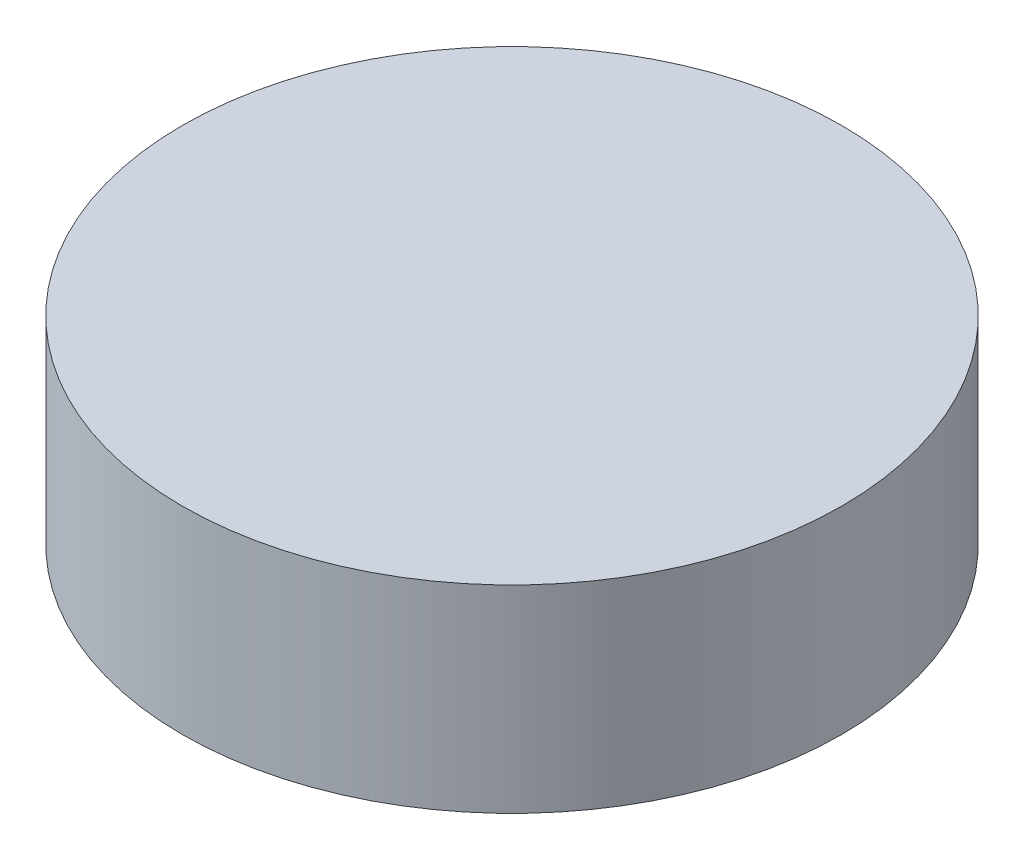
ISO-10303-21;
HEADER;
FILE_DESCRIPTION(('STEP AP214'),'2;1');
FILE_NAME('part.step','',(''),(''),'','','');
FILE_SCHEMA(('AUTOMOTIVE_DESIGN { 1 0 10303 214 1 1 1 1 }'));
ENDSEC;
DATA;
#1=APPLICATION_CONTEXT('core data for automotive mechanical design processes');
#2=APPLICATION_PROTOCOL_DEFINITION('international standard','automotive_design',2000,#1);
#3=PRODUCT_CONTEXT('',#1,'mechanical');
#4=PRODUCT('Part','Part','',(#3));
#5=PRODUCT_RELATED_PRODUCT_CATEGORY('part','',(#4));
#6=PRODUCT_DEFINITION_FORMATION('','',#4);
#7=PRODUCT_DEFINITION_CONTEXT('part definition',#1,'design');
#8=PRODUCT_DEFINITION('design','',#6,#7);
#9=PRODUCT_DEFINITION_SHAPE('','',#8);
#10=(LENGTH_UNIT() NAMED_UNIT(*) SI_UNIT(.MILLI.,.METRE.));
#11=(NAMED_UNIT(*) PLANE_ANGLE_UNIT() SI_UNIT($,.RADIAN.));
#12=(NAMED_UNIT(*) SI_UNIT($,.STERADIAN.) SOLID_ANGLE_UNIT());
#13=UNCERTAINTY_MEASURE_WITH_UNIT(LENGTH_MEASURE(1.E-05),#10,'distance_accuracy_value','');
#14=(GEOMETRIC_REPRESENTATION_CONTEXT(3) GLOBAL_UNCERTAINTY_ASSIGNED_CONTEXT((#13)) GLOBAL_UNIT_ASSIGNED_CONTEXT((#10,
#11,#12)) REPRESENTATION_CONTEXT('',''));
#15=CARTESIAN_POINT('',(0.,0.,0.));
#16=DIRECTION('',(0.,0.,1.));
#17=DIRECTION('',(1.,0.,0.));
#18=AXIS2_PLACEMENT_3D('',#15,#16,#17);
#19=CARTESIAN_POINT('',(0.,6.,0.));
#20=DIRECTION('',(0.,-1.,0.));
#21=DIRECTION('',(0.,0.,-1.));
#22=AXIS2_PLACEMENT_3D('',#19,#20,#21);
#23=CYLINDRICAL_SURFACE('',#22,10.);
#24=CARTESIAN_POINT('',(0.,6.,0.));
#25=DIRECTION('',(0.,1.,0.));
#26=DIRECTION('',(0.,0.,1.));
#27=AXIS2_PLACEMENT_3D('',#24,#25,#26);
#28=CIRCLE('',#27,10.);
#29=CARTESIAN_POINT('',(0.,6.,10.));
#30=VERTEX_POINT('',#29);
#31=EDGE_CURVE('E312',#30,#30,#28,.T.);
#32=ORIENTED_EDGE('',*,*,#31,.F.);
#33=EDGE_LOOP('',(#32));
#34=FACE_BOUND('',#33,.T.);
#35=CARTESIAN_POINT('',(0.,0.,0.));
#36=DIRECTION('',(0.,1.,0.));
#37=DIRECTION('',(0.,0.,1.));
#38=AXIS2_PLACEMENT_3D('',#35,#36,#37);
#39=CIRCLE('',#38,10.);
#40=CARTESIAN_POINT('',(0.,0.,10.));
#41=VERTEX_POINT('',#40);
#42=EDGE_CURVE('E308',#41,#41,#39,.T.);
#43=ORIENTED_EDGE('',*,*,#42,.T.);
#44=EDGE_LOOP('',(#43));
#45=FACE_BOUND('',#44,.T.);
#46=ADVANCED_FACE('F39',(#34,#45),#23,.T.);
#47=CARTESIAN_POINT('',(0.,6.,0.));
#48=DIRECTION('',(0.,1.,0.));
#49=DIRECTION('',(0.,0.,1.));
#50=AXIS2_PLACEMENT_3D('',#47,#48,#49);
#51=PLANE('',#50);
#52=ORIENTED_EDGE('',*,*,#31,.T.);
#53=EDGE_LOOP('',(#52));
#54=FACE_BOUND('',#53,.T.);
#55=ADVANCED_FACE('F393',(#54),#51,.T.);
#56=CARTESIAN_POINT('',(0.,0.,0.));
#57=DIRECTION('',(0.,1.,0.));
#58=DIRECTION('',(0.,0.,1.));
#59=AXIS2_PLACEMENT_3D('',#56,#57,#58);
#60=PLANE('',#59);
#61=CARTESIAN_POINT('',(0.,0.,0.));
#62=DIRECTION('',(0.,-1.,0.));
#63=DIRECTION('',(0.,0.,-1.));
#64=AXIS2_PLACEMENT_3D('',#61,#62,#63);
#65=CIRCLE('',#64,9.);
#66=CARTESIAN_POINT('',(0.,0.,-9.));
#67=VERTEX_POINT('',#66);
#68=EDGE_CURVE('E300',#67,#67,#65,.T.);
#69=ORIENTED_EDGE('',*,*,#68,.F.);
#70=EDGE_LOOP('',(#69));
#71=FACE_BOUND('',#70,.T.);
#72=ORIENTED_EDGE('',*,*,#42,.F.);
#73=EDGE_LOOP('',(#72));
#74=FACE_BOUND('',#73,.T.);
#75=ADVANCED_FACE('F399',(#71,#74),#60,.F.);
#76=CARTESIAN_POINT('',(0.,4.,0.));
#77=DIRECTION('',(0.,-1.,0.));
#78=DIRECTION('',(0.,0.,-1.));
#79=AXIS2_PLACEMENT_3D('',#76,#77,#78);
#80=CYLINDRICAL_SURFACE('',#79,9.);
#81=CARTESIAN_POINT('',(0.,4.,0.));
#82=DIRECTION('',(0.,-1.,0.));
#83=DIRECTION('',(0.,0.,-1.));
#84=AXIS2_PLACEMENT_3D('',#81,#82,#83);
#85=CIRCLE('',#84,9.);
#86=CARTESIAN_POINT('',(0.,4.,-9.));
#87=VERTEX_POINT('',#86);
#88=EDGE_CURVE('E304',#87,#87,#85,.T.);
#89=ORIENTED_EDGE('',*,*,#88,.F.);
#90=EDGE_LOOP('',(#89));
#91=FACE_BOUND('',#90,.T.);
#92=ORIENTED_EDGE('',*,*,#68,.T.);
#93=EDGE_LOOP('',(#92));
#94=FACE_BOUND('',#93,.T.);
#95=ADVANCED_FACE('F458',(#91,#94),#80,.F.);
#96=CARTESIAN_POINT('',(0.,4.,0.));
#97=DIRECTION('',(0.,-1.,0.));
#98=DIRECTION('',(0.,0.,-1.));
#99=AXIS2_PLACEMENT_3D('',#96,#97,#98);
#100=PLANE('',#99);
#101=CARTESIAN_POINT('',(0.,4.,0.));
#102=DIRECTION('',(0.,-1.,0.));
#103=DIRECTION('',(0.,0.,-1.));
#104=AXIS2_PLACEMENT_3D('',#101,#102,#103);
#105=CIRCLE('',#104,2.85);
#106=CARTESIAN_POINT('',(0.,4.,2.85));
#107=VERTEX_POINT('',#106);
#108=EDGE_CURVE('E276',#107,#107,#105,.T.);
#109=ORIENTED_EDGE('',*,*,#108,.F.);
#110=EDGE_LOOP('',(#109));
#111=FACE_BOUND('',#110,.T.);
#112=ORIENTED_EDGE('',*,*,#88,.T.);
#113=EDGE_LOOP('',(#112));
#114=FACE_BOUND('',#113,.T.);
#115=ADVANCED_FACE('F454',(#111,#114),#100,.T.);
#116=CARTESIAN_POINT('',(0.,-2.5,0.));
#117=DIRECTION('',(0.,1.,0.));
#118=DIRECTION('',(0.,0.,1.));
#119=AXIS2_PLACEMENT_3D('',#116,#117,#118);
#120=CYLINDRICAL_SURFACE('',#119,2.85);
#121=CARTESIAN_POINT('',(0.,-2.5,0.));
#122=DIRECTION('',(0.,-1.,0.));
#123=DIRECTION('',(0.,0.,-1.));
#124=AXIS2_PLACEMENT_3D('',#121,#122,#123);
#125=CIRCLE('',#124,2.85);
#126=CARTESIAN_POINT('',(0.,-2.5,2.85));
#127=VERTEX_POINT('',#126);
#128=EDGE_CURVE('E296',#127,#127,#125,.T.);
#129=CARTESIAN_POINT('',(0.,-2.5,2.85));
#130=CARTESIAN_POINT('',(0.,-2.43229166666667,2.85));
#131=CARTESIAN_POINT('',(0.,-2.36458333333333,2.85));
#132=CARTESIAN_POINT('',(0.,-2.22916666666667,2.85));
#133=CARTESIAN_POINT('',(0.,-2.16145833333333,2.85));
#134=CARTESIAN_POINT('',(0.,-2.02604166666667,2.85));
#135=CARTESIAN_POINT('',(0.,-1.95833333333333,2.85));
#136=CARTESIAN_POINT('',(0.,-1.82291666666667,2.85));
#137=CARTESIAN_POINT('',(0.,-1.75520833333333,2.85));
#138=CARTESIAN_POINT('',(0.,-1.61979166666667,2.85));
#139=CARTESIAN_POINT('',(0.,-1.55208333333333,2.85));
#140=CARTESIAN_POINT('',(0.,-1.41666666666667,2.85));
#141=CARTESIAN_POINT('',(0.,-1.34895833333333,2.85));
#142=CARTESIAN_POINT('',(0.,-1.21354166666667,2.85));
#143=CARTESIAN_POINT('',(0.,-1.14583333333333,2.85));
#144=CARTESIAN_POINT('',(0.,-1.01041666666667,2.85));
#145=CARTESIAN_POINT('',(0.,-0.942708333333333,2.85));
#146=CARTESIAN_POINT('',(0.,-0.807291666666666,2.85));
#147=CARTESIAN_POINT('',(0.,-0.739583333333333,2.85));
#148=CARTESIAN_POINT('',(0.,-0.604166666666666,2.85));
#149=CARTESIAN_POINT('',(0.,-0.536458333333333,2.85));
#150=CARTESIAN_POINT('',(0.,-0.401041666666667,2.85));
#151=CARTESIAN_POINT('',(0.,-0.333333333333333,2.85));
#152=CARTESIAN_POINT('',(0.,-0.197916666666666,2.85));
#153=CARTESIAN_POINT('',(0.,-0.130208333333333,2.85));
#154=CARTESIAN_POINT('',(0.,0.00520833333333364,2.85));
#155=CARTESIAN_POINT('',(0.,0.0729166666666669,2.85));
#156=CARTESIAN_POINT('',(0.,0.208333333333334,2.85));
#157=CARTESIAN_POINT('',(0.,0.276041666666667,2.85));
#158=CARTESIAN_POINT('',(0.,0.411458333333334,2.85));
#159=CARTESIAN_POINT('',(0.,0.479166666666667,2.85));
#160=CARTESIAN_POINT('',(0.,0.614583333333333,2.85));
#161=CARTESIAN_POINT('',(0.,0.682291666666667,2.85));
#162=CARTESIAN_POINT('',(0.,0.817708333333334,2.85));
#163=CARTESIAN_POINT('',(0.,0.885416666666667,2.85));
#164=CARTESIAN_POINT('',(0.,1.02083333333333,2.85));
#165=CARTESIAN_POINT('',(0.,1.08854166666667,2.85));
#166=CARTESIAN_POINT('',(0.,1.22395833333333,2.85));
#167=CARTESIAN_POINT('',(0.,1.29166666666667,2.85));
#168=CARTESIAN_POINT('',(0.,1.42708333333333,2.85));
#169=CARTESIAN_POINT('',(0.,1.49479166666667,2.85));
#170=CARTESIAN_POINT('',(0.,1.63020833333333,2.85));
#171=CARTESIAN_POINT('',(0.,1.69791666666667,2.85));
#172=CARTESIAN_POINT('',(0.,1.83333333333333,2.85));
#173=CARTESIAN_POINT('',(0.,1.90104166666667,2.85));
#174=CARTESIAN_POINT('',(0.,2.03645833333333,2.85));
#175=CARTESIAN_POINT('',(0.,2.10416666666667,2.85));
#176=CARTESIAN_POINT('',(0.,2.23958333333333,2.85));
#177=CARTESIAN_POINT('',(0.,2.30729166666667,2.85));
#178=CARTESIAN_POINT('',(0.,2.44270833333333,2.85));
#179=CARTESIAN_POINT('',(0.,2.51041666666667,2.85));
#180=CARTESIAN_POINT('',(0.,2.64583333333333,2.85));
#181=CARTESIAN_POINT('',(0.,2.71354166666667,2.85));
#182=CARTESIAN_POINT('',(0.,2.84895833333333,2.85));
#183=CARTESIAN_POINT('',(0.,2.91666666666667,2.85));
#184=CARTESIAN_POINT('',(0.,3.05208333333333,2.85));
#185=CARTESIAN_POINT('',(0.,3.11979166666667,2.85));
#186=CARTESIAN_POINT('',(0.,3.25520833333333,2.85));
#187=CARTESIAN_POINT('',(0.,3.32291666666667,2.85));
#188=CARTESIAN_POINT('',(0.,3.45833333333333,2.85));
#189=CARTESIAN_POINT('',(0.,3.52604166666667,2.85));
#190=CARTESIAN_POINT('',(0.,3.66145833333333,2.85));
#191=CARTESIAN_POINT('',(0.,3.72916666666667,2.85));
#192=CARTESIAN_POINT('',(0.,3.86458333333333,2.85));
#193=CARTESIAN_POINT('',(0.,3.93229166666667,2.85));
#194=CARTESIAN_POINT('',(0.,4.,2.85));
#195=B_SPLINE_CURVE_WITH_KNOTS('',3,(#129,#130,#131,#132,#133,#134,#135,#136,#137,#138,#139,
#140,#141,#142,#143,#144,#145,#146,#147,#148,#149,#150,#151,#152,#153,#154,#155,#156,#157,#158,
#159,#160,#161,#162,#163,#164,#165,#166,#167,#168,#169,#170,#171,#172,#173,#174,#175,#176,#177,
#178,#179,#180,#181,#182,#183,#184,#185,#186,#187,#188,#189,#190,#191,#192,#193,#194),
.UNSPECIFIED.,.F.,.F.,(4,2,2,2,2,2,2,2,2,2,2,2,2,2,2,2,2,2,2,2,2,2,2,2,2,2,2,2,2,2,2,2,4),(0.,
0.203125,0.40625,0.609375,0.8125,1.015625,1.21875,1.421875,1.625,1.828125,2.03125,2.234375,
2.4375,2.640625,2.84375,3.046875,3.25,3.453125,3.65625,3.859375,4.0625,4.265625,4.46875,
4.671875,4.875,5.078125,5.28125,5.484375,5.6875,5.890625,6.09375,6.296875,6.5),.UNSPECIFIED.);
#196=EDGE_CURVE('BSEAM451',#127,#107,#195,.T.);
#197=ORIENTED_EDGE('',*,*,#128,.F.);
#198=ORIENTED_EDGE('',*,*,#108,.T.);
#199=ORIENTED_EDGE('',*,*,#196,.T.);
#200=ORIENTED_EDGE('',*,*,#196,.F.);
#201=EDGE_LOOP('',(#197,#199,#198,#200));
#202=FACE_BOUND('',#201,.T.);
#203=ADVANCED_FACE('F451',(#202),#120,.T.);
#204=CARTESIAN_POINT('',(0.,-2.5,0.));
#205=DIRECTION('',(0.,-1.,0.));
#206=DIRECTION('',(0.,0.,-1.));
#207=AXIS2_PLACEMENT_3D('',#204,#205,#206);
#208=PLANE('',#207);
#209=DIRECTION('',(0.,0.,1.));
#210=VECTOR('',#209,1.);
#211=CARTESIAN_POINT('',(0.6,-2.5,0.));
#212=LINE('',#211,#210);
#213=CARTESIAN_POINT('',(0.6,-2.5,1.1));
#214=VERTEX_POINT('',#213);
#215=CARTESIAN_POINT('',(0.6,-2.5,2.05));
#216=VERTEX_POINT('',#215);
#217=EDGE_CURVE('E260',#214,#216,#212,.T.);
#218=ORIENTED_EDGE('',*,*,#217,.F.);
#219=CARTESIAN_POINT('',(1.1,-2.5,1.1));
#220=DIRECTION('',(0.,-1.,0.));
#221=DIRECTION('',(0.,0.,-1.));
#222=AXIS2_PLACEMENT_3D('',#219,#220,#221);
#223=CIRCLE('',#222,0.5);
#224=CARTESIAN_POINT('',(1.1,-2.5,0.6));
#225=VERTEX_POINT('',#224);
#226=EDGE_CURVE('E330',#214,#225,#223,.T.);
#227=ORIENTED_EDGE('',*,*,#226,.T.);
#228=DIRECTION('',(-1.,0.,0.));
#229=VECTOR('',#228,1.);
#230=CARTESIAN_POINT('',(0.,-2.5,0.6));
#231=LINE('',#230,#229);
#232=CARTESIAN_POINT('',(2.05,-2.5,0.6));
#233=VERTEX_POINT('',#232);
#234=EDGE_CURVE('E256',#233,#225,#231,.T.);
#235=ORIENTED_EDGE('',*,*,#234,.F.);
#236=DIRECTION('',(0.,0.,-1.));
#237=VECTOR('',#236,1.);
#238=CARTESIAN_POINT('',(2.05,-2.5,0.));
#239=LINE('',#238,#237);
#240=CARTESIAN_POINT('',(2.05,-2.5,-0.6));
#241=VERTEX_POINT('',#240);
#242=EDGE_CURVE('E252',#233,#241,#239,.T.);
#243=ORIENTED_EDGE('',*,*,#242,.T.);
#244=DIRECTION('',(-1.,0.,0.));
#245=VECTOR('',#244,1.);
#246=CARTESIAN_POINT('',(0.,-2.5,-0.6));
#247=LINE('',#246,#245);
#248=CARTESIAN_POINT('',(1.1,-2.5,-0.6));
#249=VERTEX_POINT('',#248);
#250=EDGE_CURVE('E249',#241,#249,#247,.T.);
#251=ORIENTED_EDGE('',*,*,#250,.T.);
#252=CARTESIAN_POINT('',(1.1,-2.5,-1.1));
#253=DIRECTION('',(0.,-1.,0.));
#254=DIRECTION('',(0.,0.,-1.));
#255=AXIS2_PLACEMENT_3D('',#252,#253,#254);
#256=CIRCLE('',#255,0.5);
#257=CARTESIAN_POINT('',(0.6,-2.5,-1.1));
#258=VERTEX_POINT('',#257);
#259=EDGE_CURVE('E157',#249,#258,#256,.T.);
#260=ORIENTED_EDGE('',*,*,#259,.T.);
#261=DIRECTION('',(0.,0.,1.));
#262=VECTOR('',#261,1.);
#263=CARTESIAN_POINT('',(0.6,-2.5,0.));
#264=LINE('',#263,#262);
#265=CARTESIAN_POINT('',(0.6,-2.5,-2.05));
#266=VERTEX_POINT('',#265);
#267=EDGE_CURVE('E245',#266,#258,#264,.T.);
#268=ORIENTED_EDGE('',*,*,#267,.F.);
#269=DIRECTION('',(1.,0.,0.));
#270=VECTOR('',#269,1.);
#271=CARTESIAN_POINT('',(0.,-2.5,-2.05));
#272=LINE('',#271,#270);
#273=CARTESIAN_POINT('',(-0.6,-2.5,-2.05));
#274=VERTEX_POINT('',#273);
#275=EDGE_CURVE('E241',#274,#266,#272,.T.);
#276=ORIENTED_EDGE('',*,*,#275,.F.);
#277=DIRECTION('',(0.,0.,1.));
#278=VECTOR('',#277,1.);
#279=CARTESIAN_POINT('',(-0.6,-2.5,0.));
#280=LINE('',#279,#278);
#281=CARTESIAN_POINT('',(-0.6,-2.5,-1.1));
#282=VERTEX_POINT('',#281);
#283=EDGE_CURVE('E237',#274,#282,#280,.T.);
#284=ORIENTED_EDGE('',*,*,#283,.T.);
#285=CARTESIAN_POINT('',(-1.1,-2.5,-1.1));
#286=DIRECTION('',(0.,-1.,0.));
#287=DIRECTION('',(0.,0.,-1.));
#288=AXIS2_PLACEMENT_3D('',#285,#286,#287);
#289=CIRCLE('',#288,0.5);
#290=CARTESIAN_POINT('',(-1.1,-2.5,-0.6));
#291=VERTEX_POINT('',#290);
#292=EDGE_CURVE('E324',#282,#291,#289,.T.);
#293=ORIENTED_EDGE('',*,*,#292,.T.);
#294=DIRECTION('',(-1.,0.,0.));
#295=VECTOR('',#294,1.);
#296=CARTESIAN_POINT('',(0.,-2.5,-0.6));
#297=LINE('',#296,#295);
#298=CARTESIAN_POINT('',(-2.05,-2.5,-0.6));
#299=VERTEX_POINT('',#298);
#300=EDGE_CURVE('E233',#291,#299,#297,.T.);
#301=ORIENTED_EDGE('',*,*,#300,.T.);
#302=DIRECTION('',(0.,0.,-1.));
#303=VECTOR('',#302,1.);
#304=CARTESIAN_POINT('',(-2.05,-2.5,0.));
#305=LINE('',#304,#303);
#306=CARTESIAN_POINT('',(-2.05,-2.5,0.6));
#307=VERTEX_POINT('',#306);
#308=EDGE_CURVE('E229',#307,#299,#305,.T.);
#309=ORIENTED_EDGE('',*,*,#308,.F.);
#310=DIRECTION('',(-1.,0.,0.));
#311=VECTOR('',#310,1.);
#312=CARTESIAN_POINT('',(0.,-2.5,0.6));
#313=LINE('',#312,#311);
#314=CARTESIAN_POINT('',(-1.1,-2.5,0.6));
#315=VERTEX_POINT('',#314);
#316=EDGE_CURVE('E225',#315,#307,#313,.T.);
#317=ORIENTED_EDGE('',*,*,#316,.F.);
#318=CARTESIAN_POINT('',(-1.1,-2.5,1.1));
#319=DIRECTION('',(0.,-1.,0.));
#320=DIRECTION('',(0.,0.,-1.));
#321=AXIS2_PLACEMENT_3D('',#318,#319,#320);
#322=CIRCLE('',#321,0.5);
#323=CARTESIAN_POINT('',(-0.6,-2.5,1.1));
#324=VERTEX_POINT('',#323);
#325=EDGE_CURVE('E327',#315,#324,#322,.T.);
#326=ORIENTED_EDGE('',*,*,#325,.T.);
#327=DIRECTION('',(0.,0.,1.));
#328=VECTOR('',#327,1.);
#329=CARTESIAN_POINT('',(-0.6,-2.5,0.));
#330=LINE('',#329,#328);
#331=CARTESIAN_POINT('',(-0.6,-2.5,2.05));
#332=VERTEX_POINT('',#331);
#333=EDGE_CURVE('E268',#324,#332,#330,.T.);
#334=ORIENTED_EDGE('',*,*,#333,.T.);
#335=DIRECTION('',(1.,0.,0.));
#336=VECTOR('',#335,1.);
#337=CARTESIAN_POINT('',(0.,-2.5,2.05));
#338=LINE('',#337,#336);
#339=EDGE_CURVE('E264',#332,#216,#338,.T.);
#340=ORIENTED_EDGE('',*,*,#339,.T.);
#341=EDGE_LOOP('',(#218,#227,#235,#243,#251,#260,#268,#276,#284,#293,#301,#309,#317,#326,#334,#340));
#342=FACE_BOUND('',#341,.T.);
#343=ORIENTED_EDGE('',*,*,#128,.T.);
#344=EDGE_LOOP('',(#343));
#345=FACE_BOUND('',#344,.T.);
#346=ADVANCED_FACE('F354',(#342,#345),#208,.T.);
#347=CARTESIAN_POINT('',(0.,4.,0.6));
#348=DIRECTION('',(0.,0.,1.));
#349=DIRECTION('',(1.,0.,0.));
#350=AXIS2_PLACEMENT_3D('',#347,#348,#349);
#351=PLANE('',#350);
#352=DIRECTION('',(0.,-1.,0.));
#353=VECTOR('',#352,1.);
#354=CARTESIAN_POINT('',(-2.05,4.,0.6));
#355=LINE('',#354,#353);
#356=CARTESIAN_POINT('',(-2.05,-0.999999999999998,0.6));
#357=VERTEX_POINT('',#356);
#358=EDGE_CURVE('E272',#357,#307,#355,.T.);
#359=ORIENTED_EDGE('',*,*,#358,.F.);
#360=DIRECTION('',(1.,0.,0.));
#361=VECTOR('',#360,1.);
#362=CARTESIAN_POINT('',(0.,-1.,0.6));
#363=LINE('',#362,#361);
#364=CARTESIAN_POINT('',(-1.1,-1.,0.6));
#365=VERTEX_POINT('',#364);
#366=EDGE_CURVE('E211',#357,#365,#363,.T.);
#367=ORIENTED_EDGE('',*,*,#366,.T.);
#368=DIRECTION('',(0.,-1.,0.));
#369=VECTOR('',#368,1.);
#370=CARTESIAN_POINT('',(-1.1,-2.5,0.6));
#371=LINE('',#370,#369);
#372=EDGE_CURVE('E337',#365,#315,#371,.T.);
#373=ORIENTED_EDGE('',*,*,#372,.T.);
#374=ORIENTED_EDGE('',*,*,#316,.T.);
#375=EDGE_LOOP('',(#359,#367,#373,#374));
#376=FACE_BOUND('',#375,.T.);
#377=ADVANCED_FACE('F390',(#376),#351,.F.);
#378=CARTESIAN_POINT('',(-0.6,4.,0.));
#379=DIRECTION('',(1.,0.,0.));
#380=DIRECTION('',(0.,0.,-1.));
#381=AXIS2_PLACEMENT_3D('',#378,#379,#380);
#382=PLANE('',#381);
#383=DIRECTION('',(0.,0.,-1.));
#384=VECTOR('',#383,1.);
#385=CARTESIAN_POINT('',(-0.6,-1.,0.));
#386=LINE('',#385,#384);
#387=CARTESIAN_POINT('',(-0.6,-0.999999999999998,2.05));
#388=VERTEX_POINT('',#387);
#389=CARTESIAN_POINT('',(-0.6,-1.,1.1));
#390=VERTEX_POINT('',#389);
#391=EDGE_CURVE('E55',#388,#390,#386,.T.);
#392=ORIENTED_EDGE('',*,*,#391,.F.);
#393=DIRECTION('',(0.,-1.,0.));
#394=VECTOR('',#393,1.);
#395=CARTESIAN_POINT('',(-0.6,4.,2.05));
#396=LINE('',#395,#394);
#397=EDGE_CURVE('E273',#388,#332,#396,.T.);
#398=ORIENTED_EDGE('',*,*,#397,.T.);
#399=ORIENTED_EDGE('',*,*,#333,.F.);
#400=DIRECTION('',(0.,-1.,0.));
#401=VECTOR('',#400,1.);
#402=CARTESIAN_POINT('',(-0.6,4.,1.1));
#403=LINE('',#402,#401);
#404=EDGE_CURVE('E340',#324,#390,#403,.F.);
#405=ORIENTED_EDGE('',*,*,#404,.T.);
#406=EDGE_LOOP('',(#392,#398,#399,#405));
#407=FACE_BOUND('',#406,.T.);
#408=ADVANCED_FACE('F379',(#407),#382,.T.);
#409=CARTESIAN_POINT('',(0.,4.,2.05));
#410=DIRECTION('',(0.,0.,-1.));
#411=DIRECTION('',(-1.,0.,0.));
#412=AXIS2_PLACEMENT_3D('',#409,#410,#411);
#413=PLANE('',#412);
#414=DIRECTION('',(-1.,0.,0.));
#415=VECTOR('',#414,1.);
#416=CARTESIAN_POINT('',(0.,-1.,2.05));
#417=LINE('',#416,#415);
#418=CARTESIAN_POINT('',(0.6,-0.999999999999998,2.05));
#419=VERTEX_POINT('',#418);
#420=EDGE_CURVE('E62',#419,#388,#417,.T.);
#421=ORIENTED_EDGE('',*,*,#420,.F.);
#422=DIRECTION('',(0.,-1.,0.));
#423=VECTOR('',#422,1.);
#424=CARTESIAN_POINT('',(0.6,4.,2.05));
#425=LINE('',#424,#423);
#426=EDGE_CURVE('E277',#419,#216,#425,.T.);
#427=ORIENTED_EDGE('',*,*,#426,.T.);
#428=ORIENTED_EDGE('',*,*,#339,.F.);
#429=ORIENTED_EDGE('',*,*,#397,.F.);
#430=EDGE_LOOP('',(#421,#427,#428,#429));
#431=FACE_BOUND('',#430,.T.);
#432=ADVANCED_FACE('F382',(#431),#413,.T.);
#433=CARTESIAN_POINT('',(0.6,4.,0.));
#434=DIRECTION('',(1.,0.,0.));
#435=DIRECTION('',(0.,0.,-1.));
#436=AXIS2_PLACEMENT_3D('',#433,#434,#435);
#437=PLANE('',#436);
#438=ORIENTED_EDGE('',*,*,#426,.F.);
#439=DIRECTION('',(0.,0.,-1.));
#440=VECTOR('',#439,1.);
#441=CARTESIAN_POINT('',(0.6,-1.,0.));
#442=LINE('',#441,#440);
#443=CARTESIAN_POINT('',(0.6,-1.,1.1));
#444=VERTEX_POINT('',#443);
#445=EDGE_CURVE('E197',#419,#444,#442,.T.);
#446=ORIENTED_EDGE('',*,*,#445,.T.);
#447=DIRECTION('',(0.,-1.,0.));
#448=VECTOR('',#447,1.);
#449=CARTESIAN_POINT('',(0.6,4.,1.1));
#450=LINE('',#449,#448);
#451=EDGE_CURVE('E316',#444,#214,#450,.T.);
#452=ORIENTED_EDGE('',*,*,#451,.T.);
#453=ORIENTED_EDGE('',*,*,#217,.T.);
#454=EDGE_LOOP('',(#438,#446,#452,#453));
#455=FACE_BOUND('',#454,.T.);
#456=ADVANCED_FACE('F371',(#455),#437,.F.);
#457=CARTESIAN_POINT('',(0.,4.,0.6));
#458=DIRECTION('',(0.,0.,1.));
#459=DIRECTION('',(1.,0.,0.));
#460=AXIS2_PLACEMENT_3D('',#457,#458,#459);
#461=PLANE('',#460);
#462=DIRECTION('',(0.,-1.,0.));
#463=VECTOR('',#462,1.);
#464=CARTESIAN_POINT('',(1.1,4.,0.6));
#465=LINE('',#464,#463);
#466=CARTESIAN_POINT('',(1.1,-1.,0.6));
#467=VERTEX_POINT('',#466);
#468=EDGE_CURVE('E333',#225,#467,#465,.F.);
#469=ORIENTED_EDGE('',*,*,#468,.T.);
#470=DIRECTION('',(1.,0.,0.));
#471=VECTOR('',#470,1.);
#472=CARTESIAN_POINT('',(0.,-1.,0.6));
#473=LINE('',#472,#471);
#474=CARTESIAN_POINT('',(2.05,-0.999999999999998,0.6));
#475=VERTEX_POINT('',#474);
#476=EDGE_CURVE('E188',#467,#475,#473,.T.);
#477=ORIENTED_EDGE('',*,*,#476,.T.);
#478=DIRECTION('',(0.,-1.,0.));
#479=VECTOR('',#478,1.);
#480=CARTESIAN_POINT('',(2.05,4.,0.6));
#481=LINE('',#480,#479);
#482=EDGE_CURVE('E280',#475,#233,#481,.T.);
#483=ORIENTED_EDGE('',*,*,#482,.T.);
#484=ORIENTED_EDGE('',*,*,#234,.T.);
#485=EDGE_LOOP('',(#469,#477,#483,#484));
#486=FACE_BOUND('',#485,.T.);
#487=ADVANCED_FACE('F364',(#486),#461,.F.);
#488=CARTESIAN_POINT('',(2.05,4.,0.));
#489=DIRECTION('',(-1.,0.,0.));
#490=DIRECTION('',(0.,0.,1.));
#491=AXIS2_PLACEMENT_3D('',#488,#489,#490);
#492=PLANE('',#491);
#493=DIRECTION('',(0.,0.,1.));
#494=VECTOR('',#493,1.);
#495=CARTESIAN_POINT('',(2.05,-1.,0.));
#496=LINE('',#495,#494);
#497=CARTESIAN_POINT('',(2.05,-0.999999999999998,-0.6));
#498=VERTEX_POINT('',#497);
#499=EDGE_CURVE('E172',#498,#475,#496,.T.);
#500=ORIENTED_EDGE('',*,*,#499,.F.);
#501=DIRECTION('',(0.,-1.,0.));
#502=VECTOR('',#501,1.);
#503=CARTESIAN_POINT('',(2.05,4.,-0.6));
#504=LINE('',#503,#502);
#505=EDGE_CURVE('E168',#498,#241,#504,.T.);
#506=ORIENTED_EDGE('',*,*,#505,.T.);
#507=ORIENTED_EDGE('',*,*,#242,.F.);
#508=ORIENTED_EDGE('',*,*,#482,.F.);
#509=EDGE_LOOP('',(#500,#506,#507,#508));
#510=FACE_BOUND('',#509,.T.);
#511=ADVANCED_FACE('F360',(#510),#492,.T.);
#512=CARTESIAN_POINT('',(0.,4.,-0.6));
#513=DIRECTION('',(0.,0.,1.));
#514=DIRECTION('',(1.,0.,0.));
#515=AXIS2_PLACEMENT_3D('',#512,#513,#514);
#516=PLANE('',#515);
#517=DIRECTION('',(1.,0.,0.));
#518=VECTOR('',#517,1.);
#519=CARTESIAN_POINT('',(0.,-1.,-0.6));
#520=LINE('',#519,#518);
#521=CARTESIAN_POINT('',(1.1,-1.,-0.6));
#522=VERTEX_POINT('',#521);
#523=EDGE_CURVE('E166',#522,#498,#520,.T.);
#524=ORIENTED_EDGE('',*,*,#523,.F.);
#525=DIRECTION('',(0.,-1.,0.));
#526=VECTOR('',#525,1.);
#527=CARTESIAN_POINT('',(1.1,-2.5,-0.6));
#528=LINE('',#527,#526);
#529=EDGE_CURVE('E153',#522,#249,#528,.T.);
#530=ORIENTED_EDGE('',*,*,#529,.T.);
#531=ORIENTED_EDGE('',*,*,#250,.F.);
#532=ORIENTED_EDGE('',*,*,#505,.F.);
#533=EDGE_LOOP('',(#524,#530,#531,#532));
#534=FACE_BOUND('',#533,.T.);
#535=ADVANCED_FACE('F167',(#534),#516,.T.);
#536=CARTESIAN_POINT('',(0.6,4.,0.));
#537=DIRECTION('',(1.,0.,0.));
#538=DIRECTION('',(0.,0.,-1.));
#539=AXIS2_PLACEMENT_3D('',#536,#537,#538);
#540=PLANE('',#539);
#541=DIRECTION('',(0.,-1.,0.));
#542=VECTOR('',#541,1.);
#543=CARTESIAN_POINT('',(0.6,4.,-1.1));
#544=LINE('',#543,#542);
#545=CARTESIAN_POINT('',(0.6,-1.,-1.1));
#546=VERTEX_POINT('',#545);
#547=EDGE_CURVE('E48',#258,#546,#544,.F.);
#548=ORIENTED_EDGE('',*,*,#547,.T.);
#549=DIRECTION('',(0.,0.,-1.));
#550=VECTOR('',#549,1.);
#551=CARTESIAN_POINT('',(0.6,-1.,0.));
#552=LINE('',#551,#550);
#553=CARTESIAN_POINT('',(0.6,-0.999999999999998,-2.05));
#554=VERTEX_POINT('',#553);
#555=EDGE_CURVE('E173',#546,#554,#552,.T.);
#556=ORIENTED_EDGE('',*,*,#555,.T.);
#557=DIRECTION('',(0.,-1.,0.));
#558=VECTOR('',#557,1.);
#559=CARTESIAN_POINT('',(0.6,4.,-2.05));
#560=LINE('',#559,#558);
#561=EDGE_CURVE('E285',#554,#266,#560,.T.);
#562=ORIENTED_EDGE('',*,*,#561,.T.);
#563=ORIENTED_EDGE('',*,*,#267,.T.);
#564=EDGE_LOOP('',(#548,#556,#562,#563));
#565=FACE_BOUND('',#564,.T.);
#566=ADVANCED_FACE('F349',(#565),#540,.F.);
#567=CARTESIAN_POINT('',(0.,4.,-2.05));
#568=DIRECTION('',(0.,0.,-1.));
#569=DIRECTION('',(-1.,0.,0.));
#570=AXIS2_PLACEMENT_3D('',#567,#568,#569);
#571=PLANE('',#570);
#572=ORIENTED_EDGE('',*,*,#561,.F.);
#573=DIRECTION('',(-1.,0.,0.));
#574=VECTOR('',#573,1.);
#575=CARTESIAN_POINT('',(0.,-1.,-2.05));
#576=LINE('',#575,#574);
#577=CARTESIAN_POINT('',(-0.6,-0.999999999999998,-2.05));
#578=VERTEX_POINT('',#577);
#579=EDGE_CURVE('E180',#554,#578,#576,.T.);
#580=ORIENTED_EDGE('',*,*,#579,.T.);
#581=DIRECTION('',(0.,-1.,0.));
#582=VECTOR('',#581,1.);
#583=CARTESIAN_POINT('',(-0.6,4.,-2.05));
#584=LINE('',#583,#582);
#585=EDGE_CURVE('E288',#578,#274,#584,.T.);
#586=ORIENTED_EDGE('',*,*,#585,.T.);
#587=ORIENTED_EDGE('',*,*,#275,.T.);
#588=EDGE_LOOP('',(#572,#580,#586,#587));
#589=FACE_BOUND('',#588,.T.);
#590=ADVANCED_FACE('F432',(#589),#571,.F.);
#591=CARTESIAN_POINT('',(-0.6,4.,0.));
#592=DIRECTION('',(1.,0.,0.));
#593=DIRECTION('',(0.,0.,-1.));
#594=AXIS2_PLACEMENT_3D('',#591,#592,#593);
#595=PLANE('',#594);
#596=DIRECTION('',(0.,0.,-1.));
#597=VECTOR('',#596,1.);
#598=CARTESIAN_POINT('',(-0.6,-1.,0.));
#599=LINE('',#598,#597);
#600=CARTESIAN_POINT('',(-0.6,-1.,-1.1));
#601=VERTEX_POINT('',#600);
#602=EDGE_CURVE('E208',#601,#578,#599,.T.);
#603=ORIENTED_EDGE('',*,*,#602,.F.);
#604=DIRECTION('',(0.,-1.,0.));
#605=VECTOR('',#604,1.);
#606=CARTESIAN_POINT('',(-0.6,4.,-1.1));
#607=LINE('',#606,#605);
#608=EDGE_CURVE('E343',#601,#282,#607,.T.);
#609=ORIENTED_EDGE('',*,*,#608,.T.);
#610=ORIENTED_EDGE('',*,*,#283,.F.);
#611=ORIENTED_EDGE('',*,*,#585,.F.);
#612=EDGE_LOOP('',(#603,#609,#610,#611));
#613=FACE_BOUND('',#612,.T.);
#614=ADVANCED_FACE('F430',(#613),#595,.T.);
#615=CARTESIAN_POINT('',(0.,4.,-0.6));
#616=DIRECTION('',(0.,0.,1.));
#617=DIRECTION('',(1.,0.,0.));
#618=AXIS2_PLACEMENT_3D('',#615,#616,#617);
#619=PLANE('',#618);
#620=DIRECTION('',(1.,0.,0.));
#621=VECTOR('',#620,1.);
#622=CARTESIAN_POINT('',(0.,-1.,-0.6));
#623=LINE('',#622,#621);
#624=CARTESIAN_POINT('',(-2.05,-0.999999999999998,-0.6));
#625=VERTEX_POINT('',#624);
#626=CARTESIAN_POINT('',(-1.1,-1.,-0.6));
#627=VERTEX_POINT('',#626);
#628=EDGE_CURVE('E221',#625,#627,#623,.T.);
#629=ORIENTED_EDGE('',*,*,#628,.F.);
#630=DIRECTION('',(0.,-1.,0.));
#631=VECTOR('',#630,1.);
#632=CARTESIAN_POINT('',(-2.05,4.,-0.6));
#633=LINE('',#632,#631);
#634=EDGE_CURVE('E291',#625,#299,#633,.T.);
#635=ORIENTED_EDGE('',*,*,#634,.T.);
#636=ORIENTED_EDGE('',*,*,#300,.F.);
#637=DIRECTION('',(0.,-1.,0.));
#638=VECTOR('',#637,1.);
#639=CARTESIAN_POINT('',(-1.1,4.,-0.6));
#640=LINE('',#639,#638);
#641=EDGE_CURVE('E162',#291,#627,#640,.F.);
#642=ORIENTED_EDGE('',*,*,#641,.T.);
#643=EDGE_LOOP('',(#629,#635,#636,#642));
#644=FACE_BOUND('',#643,.T.);
#645=ADVANCED_FACE('F421',(#644),#619,.T.);
#646=CARTESIAN_POINT('',(-2.05,4.,0.));
#647=DIRECTION('',(-1.,0.,0.));
#648=DIRECTION('',(0.,0.,1.));
#649=AXIS2_PLACEMENT_3D('',#646,#647,#648);
#650=PLANE('',#649);
#651=ORIENTED_EDGE('',*,*,#634,.F.);
#652=DIRECTION('',(0.,0.,1.));
#653=VECTOR('',#652,1.);
#654=CARTESIAN_POINT('',(-2.05,-1.,0.));
#655=LINE('',#654,#653);
#656=EDGE_CURVE('E218',#625,#357,#655,.T.);
#657=ORIENTED_EDGE('',*,*,#656,.T.);
#658=ORIENTED_EDGE('',*,*,#358,.T.);
#659=ORIENTED_EDGE('',*,*,#308,.T.);
#660=EDGE_LOOP('',(#651,#657,#658,#659));
#661=FACE_BOUND('',#660,.T.);
#662=ADVANCED_FACE('F408',(#661),#650,.F.);
#663=CARTESIAN_POINT('',(1.1,4.,1.1));
#664=DIRECTION('',(0.,-1.,0.));
#665=DIRECTION('',(0.,0.,-1.));
#666=AXIS2_PLACEMENT_3D('',#663,#664,#665);
#667=CYLINDRICAL_SURFACE('',#666,0.5);
#668=CARTESIAN_POINT('',(1.1,-1.,1.1));
#669=DIRECTION('',(0.,-1.,0.));
#670=DIRECTION('',(0.,0.,-1.));
#671=AXIS2_PLACEMENT_3D('',#668,#669,#670);
#672=CIRCLE('',#671,0.5);
#673=EDGE_CURVE('E191',#467,#444,#672,.F.);
#674=ORIENTED_EDGE('',*,*,#673,.F.);
#675=ORIENTED_EDGE('',*,*,#468,.F.);
#676=ORIENTED_EDGE('',*,*,#226,.F.);
#677=ORIENTED_EDGE('',*,*,#451,.F.);
#678=EDGE_LOOP('',(#674,#675,#676,#677));
#679=FACE_BOUND('',#678,.T.);
#680=ADVANCED_FACE('F368',(#679),#667,.T.);
#681=CARTESIAN_POINT('',(-1.1,4.,1.1));
#682=DIRECTION('',(0.,1.,0.));
#683=DIRECTION('',(0.,0.,1.));
#684=AXIS2_PLACEMENT_3D('',#681,#682,#683);
#685=CYLINDRICAL_SURFACE('',#684,0.5);
#686=CARTESIAN_POINT('',(-1.1,-1.,1.1));
#687=DIRECTION('',(0.,-1.,0.));
#688=DIRECTION('',(0.,0.,-1.));
#689=AXIS2_PLACEMENT_3D('',#686,#687,#688);
#690=CIRCLE('',#689,0.5);
#691=EDGE_CURVE('E204',#390,#365,#690,.F.);
#692=ORIENTED_EDGE('',*,*,#691,.F.);
#693=ORIENTED_EDGE('',*,*,#404,.F.);
#694=ORIENTED_EDGE('',*,*,#325,.F.);
#695=ORIENTED_EDGE('',*,*,#372,.F.);
#696=EDGE_LOOP('',(#692,#693,#694,#695));
#697=FACE_BOUND('',#696,.T.);
#698=ADVANCED_FACE('F376',(#697),#685,.T.);
#699=CARTESIAN_POINT('',(-1.1,4.,-1.1));
#700=DIRECTION('',(0.,-1.,0.));
#701=DIRECTION('',(0.,0.,-1.));
#702=AXIS2_PLACEMENT_3D('',#699,#700,#701);
#703=CYLINDRICAL_SURFACE('',#702,0.5);
#704=CARTESIAN_POINT('',(-1.1,-1.,-1.1));
#705=DIRECTION('',(0.,-1.,0.));
#706=DIRECTION('',(0.,0.,-1.));
#707=AXIS2_PLACEMENT_3D('',#704,#705,#706);
#708=CIRCLE('',#707,0.5);
#709=EDGE_CURVE('E214',#627,#601,#708,.F.);
#710=ORIENTED_EDGE('',*,*,#709,.F.);
#711=ORIENTED_EDGE('',*,*,#641,.F.);
#712=ORIENTED_EDGE('',*,*,#292,.F.);
#713=ORIENTED_EDGE('',*,*,#608,.F.);
#714=EDGE_LOOP('',(#710,#711,#712,#713));
#715=FACE_BOUND('',#714,.T.);
#716=ADVANCED_FACE('F410',(#715),#703,.T.);
#717=CARTESIAN_POINT('',(1.1,4.,-1.1));
#718=DIRECTION('',(0.,1.,0.));
#719=DIRECTION('',(0.,0.,1.));
#720=AXIS2_PLACEMENT_3D('',#717,#718,#719);
#721=CYLINDRICAL_SURFACE('',#720,0.5);
#722=CARTESIAN_POINT('',(1.1,-1.,-1.1));
#723=DIRECTION('',(0.,-1.,0.));
#724=DIRECTION('',(0.,0.,-1.));
#725=AXIS2_PLACEMENT_3D('',#722,#723,#724);
#726=CIRCLE('',#725,0.5);
#727=EDGE_CURVE('E11',#546,#522,#726,.F.);
#728=ORIENTED_EDGE('',*,*,#727,.F.);
#729=ORIENTED_EDGE('',*,*,#547,.F.);
#730=ORIENTED_EDGE('',*,*,#259,.F.);
#731=ORIENTED_EDGE('',*,*,#529,.F.);
#732=EDGE_LOOP('',(#728,#729,#730,#731));
#733=FACE_BOUND('',#732,.T.);
#734=ADVANCED_FACE('F41',(#733),#721,.T.);
#735=CARTESIAN_POINT('',(0.,-1.,0.));
#736=DIRECTION('',(0.,-1.,0.));
#737=DIRECTION('',(0.,0.,-1.));
#738=AXIS2_PLACEMENT_3D('',#735,#736,#737);
#739=PLANE('',#738);
#740=ORIENTED_EDGE('',*,*,#656,.F.);
#741=ORIENTED_EDGE('',*,*,#628,.T.);
#742=ORIENTED_EDGE('',*,*,#709,.T.);
#743=ORIENTED_EDGE('',*,*,#602,.T.);
#744=ORIENTED_EDGE('',*,*,#579,.F.);
#745=ORIENTED_EDGE('',*,*,#555,.F.);
#746=ORIENTED_EDGE('',*,*,#727,.T.);
#747=ORIENTED_EDGE('',*,*,#523,.T.);
#748=ORIENTED_EDGE('',*,*,#499,.T.);
#749=ORIENTED_EDGE('',*,*,#476,.F.);
#750=ORIENTED_EDGE('',*,*,#673,.T.);
#751=ORIENTED_EDGE('',*,*,#445,.F.);
#752=ORIENTED_EDGE('',*,*,#420,.T.);
#753=ORIENTED_EDGE('',*,*,#391,.T.);
#754=ORIENTED_EDGE('',*,*,#691,.T.);
#755=ORIENTED_EDGE('',*,*,#366,.F.);
#756=EDGE_LOOP('',(#740,#741,#742,#743,#744,#745,#746,#747,#748,#749,#750,#751,#752,#753,#754,#755));
#757=FACE_BOUND('',#756,.T.);
#758=ADVANCED_FACE('F177',(#757),#739,.T.);
#759=CLOSED_SHELL('',(#46,#55,#75,#95,#115,#203,#346,#377,#408,#432,#456,#487,#511,#535,#566,
#590,#614,#645,#662,#680,#698,#716,#734,#758));
#760=MANIFOLD_SOLID_BREP('B2',#759);
#761=ADVANCED_BREP_SHAPE_REPRESENTATION('',(#18,#760),#14);
#762=SHAPE_DEFINITION_REPRESENTATION(#9,#761);
ENDSEC;
END-ISO-10303-21;
